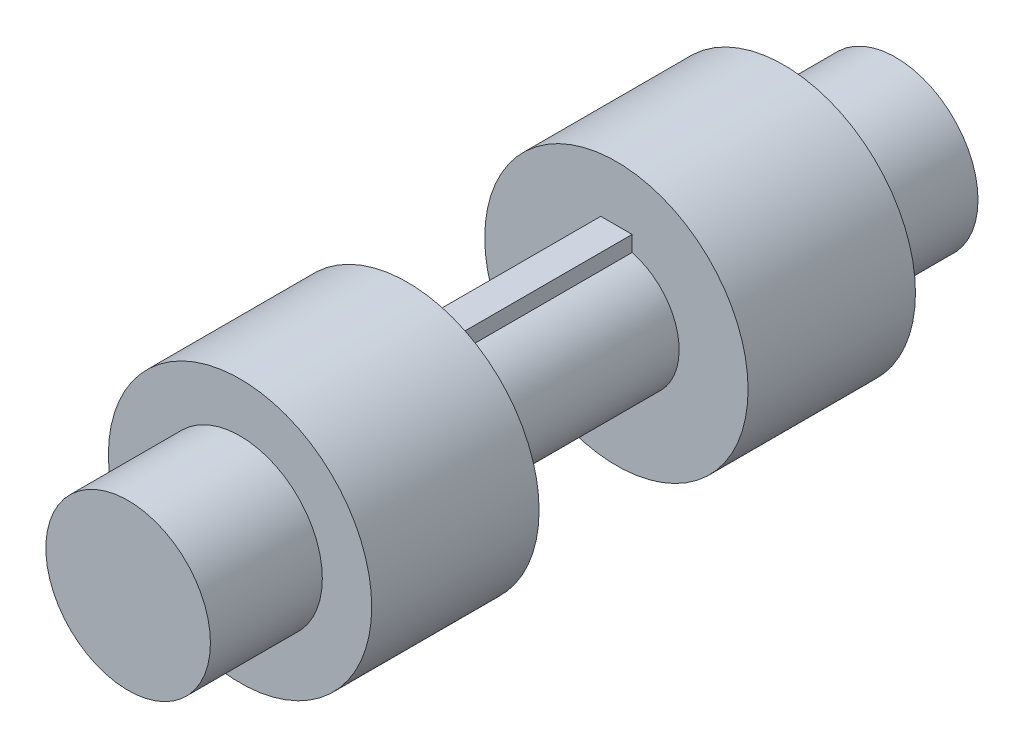
ISO-10303-21;
HEADER;
FILE_DESCRIPTION(('STEP AP214'),'2;1');
FILE_NAME('part.step','',(''),(''),'','','');
FILE_SCHEMA(('AUTOMOTIVE_DESIGN { 1 0 10303 214 1 1 1 1 }'));
ENDSEC;
DATA;
#1=APPLICATION_CONTEXT('core data for automotive mechanical design processes');
#2=APPLICATION_PROTOCOL_DEFINITION('international standard','automotive_design',2000,#1);
#3=PRODUCT_CONTEXT('',#1,'mechanical');
#4=PRODUCT('Part','Part','',(#3));
#5=PRODUCT_RELATED_PRODUCT_CATEGORY('part','',(#4));
#6=PRODUCT_DEFINITION_FORMATION('','',#4);
#7=PRODUCT_DEFINITION_CONTEXT('part definition',#1,'design');
#8=PRODUCT_DEFINITION('design','',#6,#7);
#9=PRODUCT_DEFINITION_SHAPE('','',#8);
#10=(LENGTH_UNIT() NAMED_UNIT(*) SI_UNIT(.MILLI.,.METRE.));
#11=(NAMED_UNIT(*) PLANE_ANGLE_UNIT() SI_UNIT($,.RADIAN.));
#12=(NAMED_UNIT(*) SI_UNIT($,.STERADIAN.) SOLID_ANGLE_UNIT());
#13=UNCERTAINTY_MEASURE_WITH_UNIT(LENGTH_MEASURE(1.E-05),#10,'distance_accuracy_value','');
#14=(GEOMETRIC_REPRESENTATION_CONTEXT(3) GLOBAL_UNCERTAINTY_ASSIGNED_CONTEXT((#13)) GLOBAL_UNIT_ASSIGNED_CONTEXT((#10,
#11,#12)) REPRESENTATION_CONTEXT('',''));
#15=CARTESIAN_POINT('',(0.,0.,0.));
#16=DIRECTION('',(0.,0.,1.));
#17=DIRECTION('',(1.,0.,0.));
#18=AXIS2_PLACEMENT_3D('',#15,#16,#17);
#19=CARTESIAN_POINT('',(0.,0.,-17.));
#20=DIRECTION('',(0.,0.,1.));
#21=DIRECTION('',(1.,0.,0.));
#22=AXIS2_PLACEMENT_3D('',#19,#20,#21);
#23=CYLINDRICAL_SURFACE('',#22,12.5);
#24=CARTESIAN_POINT('',(0.,0.,-17.));
#25=DIRECTION('',(0.,0.,1.));
#26=DIRECTION('',(1.,0.,0.));
#27=AXIS2_PLACEMENT_3D('',#24,#25,#26);
#28=CIRCLE('',#27,12.5);
#29=CARTESIAN_POINT('',(12.5,0.,-17.));
#30=VERTEX_POINT('',#29);
#31=EDGE_CURVE('E113',#30,#30,#28,.T.);
#32=ORIENTED_EDGE('',*,*,#31,.T.);
#33=EDGE_LOOP('',(#32));
#34=FACE_BOUND('',#33,.T.);
#35=CARTESIAN_POINT('',(0.,0.,0.));
#36=DIRECTION('',(0.,0.,1.));
#37=DIRECTION('',(1.,0.,0.));
#38=AXIS2_PLACEMENT_3D('',#35,#36,#37);
#39=CIRCLE('',#38,12.5);
#40=CARTESIAN_POINT('',(12.5,0.,0.));
#41=VERTEX_POINT('',#40);
#42=EDGE_CURVE('E36',#41,#41,#39,.T.);
#43=ORIENTED_EDGE('',*,*,#42,.F.);
#44=EDGE_LOOP('',(#43));
#45=FACE_BOUND('',#44,.T.);
#46=ADVANCED_FACE('F33',(#34,#45),#23,.T.);
#47=CARTESIAN_POINT('',(0.,0.,-17.));
#48=DIRECTION('',(0.,0.,1.));
#49=DIRECTION('',(1.,0.,0.));
#50=AXIS2_PLACEMENT_3D('',#47,#48,#49);
#51=PLANE('',#50);
#52=ORIENTED_EDGE('',*,*,#31,.F.);
#53=EDGE_LOOP('',(#52));
#54=FACE_BOUND('',#53,.T.);
#55=ADVANCED_FACE('F128',(#54),#51,.F.);
#56=CARTESIAN_POINT('',(0.,0.,25.425));
#57=DIRECTION('',(0.,0.,-1.));
#58=DIRECTION('',(-1.,0.,0.));
#59=AXIS2_PLACEMENT_3D('',#56,#57,#58);
#60=CYLINDRICAL_SURFACE('',#59,20.);
#61=CARTESIAN_POINT('',(0.,0.,25.425));
#62=DIRECTION('',(0.,0.,1.));
#63=DIRECTION('',(1.,0.,0.));
#64=AXIS2_PLACEMENT_3D('',#61,#62,#63);
#65=CIRCLE('',#64,20.);
#66=CARTESIAN_POINT('',(-20.,0.,25.425));
#67=VERTEX_POINT('',#66);
#68=EDGE_CURVE('E114',#67,#67,#65,.T.);
#69=CARTESIAN_POINT('',(0.,0.,0.));
#70=DIRECTION('',(0.,0.,1.));
#71=DIRECTION('',(1.,0.,0.));
#72=AXIS2_PLACEMENT_3D('',#69,#70,#71);
#73=CIRCLE('',#72,20.);
#74=CARTESIAN_POINT('',(-20.,0.,0.));
#75=VERTEX_POINT('',#74);
#76=EDGE_CURVE('E82',#75,#75,#73,.T.);
#77=CARTESIAN_POINT('',(-20.,0.,25.425));
#78=CARTESIAN_POINT('',(-20.,0.,25.16015625));
#79=CARTESIAN_POINT('',(-20.,0.,24.8953125));
#80=CARTESIAN_POINT('',(-20.,0.,24.365625));
#81=CARTESIAN_POINT('',(-20.,0.,24.10078125));
#82=CARTESIAN_POINT('',(-20.,0.,23.57109375));
#83=CARTESIAN_POINT('',(-20.,0.,23.30625));
#84=CARTESIAN_POINT('',(-20.,0.,22.7765625));
#85=CARTESIAN_POINT('',(-20.,0.,22.51171875));
#86=CARTESIAN_POINT('',(-20.,0.,21.98203125));
#87=CARTESIAN_POINT('',(-20.,0.,21.7171875));
#88=CARTESIAN_POINT('',(-20.,0.,21.1875));
#89=CARTESIAN_POINT('',(-20.,0.,20.92265625));
#90=CARTESIAN_POINT('',(-20.,0.,20.39296875));
#91=CARTESIAN_POINT('',(-20.,0.,20.128125));
#92=CARTESIAN_POINT('',(-20.,0.,19.5984375));
#93=CARTESIAN_POINT('',(-20.,0.,19.33359375));
#94=CARTESIAN_POINT('',(-20.,0.,18.80390625));
#95=CARTESIAN_POINT('',(-20.,0.,18.5390625));
#96=CARTESIAN_POINT('',(-20.,0.,18.009375));
#97=CARTESIAN_POINT('',(-20.,0.,17.74453125));
#98=CARTESIAN_POINT('',(-20.,0.,17.21484375));
#99=CARTESIAN_POINT('',(-20.,0.,16.95));
#100=CARTESIAN_POINT('',(-20.,0.,16.4203125));
#101=CARTESIAN_POINT('',(-20.,0.,16.15546875));
#102=CARTESIAN_POINT('',(-20.,0.,15.62578125));
#103=CARTESIAN_POINT('',(-20.,0.,15.3609375));
#104=CARTESIAN_POINT('',(-20.,0.,14.83125));
#105=CARTESIAN_POINT('',(-20.,0.,14.56640625));
#106=CARTESIAN_POINT('',(-20.,0.,14.03671875));
#107=CARTESIAN_POINT('',(-20.,0.,13.771875));
#108=CARTESIAN_POINT('',(-20.,0.,13.2421875));
#109=CARTESIAN_POINT('',(-20.,0.,12.97734375));
#110=CARTESIAN_POINT('',(-20.,0.,12.44765625));
#111=CARTESIAN_POINT('',(-20.,0.,12.1828125));
#112=CARTESIAN_POINT('',(-20.,0.,11.653125));
#113=CARTESIAN_POINT('',(-20.,0.,11.38828125));
#114=CARTESIAN_POINT('',(-20.,0.,10.85859375));
#115=CARTESIAN_POINT('',(-20.,0.,10.59375));
#116=CARTESIAN_POINT('',(-20.,0.,10.0640625));
#117=CARTESIAN_POINT('',(-20.,0.,9.79921875));
#118=CARTESIAN_POINT('',(-20.,0.,9.26953125));
#119=CARTESIAN_POINT('',(-20.,0.,9.0046875));
#120=CARTESIAN_POINT('',(-20.,0.,8.475));
#121=CARTESIAN_POINT('',(-20.,0.,8.21015625));
#122=CARTESIAN_POINT('',(-20.,0.,7.68046875));
#123=CARTESIAN_POINT('',(-20.,0.,7.415625));
#124=CARTESIAN_POINT('',(-20.,0.,6.8859375));
#125=CARTESIAN_POINT('',(-20.,0.,6.62109375));
#126=CARTESIAN_POINT('',(-20.,0.,6.09140625));
#127=CARTESIAN_POINT('',(-20.,0.,5.8265625));
#128=CARTESIAN_POINT('',(-20.,0.,5.296875));
#129=CARTESIAN_POINT('',(-20.,0.,5.03203125));
#130=CARTESIAN_POINT('',(-20.,0.,4.50234375));
#131=CARTESIAN_POINT('',(-20.,0.,4.2375));
#132=CARTESIAN_POINT('',(-20.,0.,3.7078125));
#133=CARTESIAN_POINT('',(-20.,0.,3.44296875));
#134=CARTESIAN_POINT('',(-20.,0.,2.91328125));
#135=CARTESIAN_POINT('',(-20.,0.,2.6484375));
#136=CARTESIAN_POINT('',(-20.,0.,2.11875));
#137=CARTESIAN_POINT('',(-20.,0.,1.85390625));
#138=CARTESIAN_POINT('',(-20.,0.,1.32421875));
#139=CARTESIAN_POINT('',(-20.,0.,1.059375));
#140=CARTESIAN_POINT('',(-20.,0.,0.529687500000001));
#141=CARTESIAN_POINT('',(-20.,0.,0.264843750000001));
#142=CARTESIAN_POINT('',(-20.,0.,0.));
#143=B_SPLINE_CURVE_WITH_KNOTS('',3,(#77,#78,#79,#80,#81,#82,#83,#84,#85,#86,#87,#88,#89,#90,
#91,#92,#93,#94,#95,#96,#97,#98,#99,#100,#101,#102,#103,#104,#105,#106,#107,#108,#109,#110,#111,
#112,#113,#114,#115,#116,#117,#118,#119,#120,#121,#122,#123,#124,#125,#126,#127,#128,#129,#130,
#131,#132,#133,#134,#135,#136,#137,#138,#139,#140,#141,#142),.UNSPECIFIED.,.F.,.F.,(4,2,2,2,2,2,
2,2,2,2,2,2,2,2,2,2,2,2,2,2,2,2,2,2,2,2,2,2,2,2,2,2,4),(0.,0.794531250000001,1.5890625,
2.38359375,3.178125,3.97265625,4.7671875,5.56171875,6.35625,7.15078125,7.9453125,8.73984375,
9.534375,10.32890625,11.1234375,11.91796875,12.7125,13.50703125,14.3015625,15.09609375,
15.890625,16.68515625,17.4796875,18.27421875,19.06875,19.86328125,20.6578125,21.45234375,
22.246875,23.04140625,23.8359375,24.63046875,25.425),.UNSPECIFIED.);
#144=EDGE_CURVE('BSEAM132',#67,#75,#143,.T.);
#145=ORIENTED_EDGE('',*,*,#68,.F.);
#146=ORIENTED_EDGE('',*,*,#76,.T.);
#147=ORIENTED_EDGE('',*,*,#144,.T.);
#148=ORIENTED_EDGE('',*,*,#144,.F.);
#149=EDGE_LOOP('',(#145,#147,#146,#148));
#150=FACE_BOUND('',#149,.T.);
#151=ADVANCED_FACE('F132',(#150),#60,.T.);
#152=CARTESIAN_POINT('',(0.,0.,25.425));
#153=DIRECTION('',(0.,0.,1.));
#154=DIRECTION('',(1.,0.,0.));
#155=AXIS2_PLACEMENT_3D('',#152,#153,#154);
#156=PLANE('',#155);
#157=DIRECTION('',(0.,1.,0.));
#158=VECTOR('',#157,1.);
#159=CARTESIAN_POINT('',(-2.38125,11.6037915931564,25.425));
#160=LINE('',#159,#158);
#161=CARTESIAN_POINT('',(-2.38125,9.22254159315641,25.425));
#162=VERTEX_POINT('',#161);
#163=CARTESIAN_POINT('',(-2.38125,11.6037915931564,25.425));
#164=VERTEX_POINT('',#163);
#165=EDGE_CURVE('E83',#162,#164,#160,.T.);
#166=ORIENTED_EDGE('',*,*,#165,.T.);
#167=DIRECTION('',(1.,0.,0.));
#168=VECTOR('',#167,1.);
#169=CARTESIAN_POINT('',(2.38125,11.6037915931564,25.425));
#170=LINE('',#169,#168);
#171=CARTESIAN_POINT('',(2.38125,11.6037915931564,25.425));
#172=VERTEX_POINT('',#171);
#173=EDGE_CURVE('E184',#164,#172,#170,.T.);
#174=ORIENTED_EDGE('',*,*,#173,.T.);
#175=DIRECTION('',(0.,-1.,0.));
#176=VECTOR('',#175,1.);
#177=CARTESIAN_POINT('',(2.38125,11.6037915931564,25.425));
#178=LINE('',#177,#176);
#179=CARTESIAN_POINT('',(2.38125,9.22254159315641,25.425));
#180=VERTEX_POINT('',#179);
#181=EDGE_CURVE('E49',#172,#180,#178,.T.);
#182=ORIENTED_EDGE('',*,*,#181,.T.);
#183=CARTESIAN_POINT('',(0.,0.,25.425));
#184=DIRECTION('',(0.,0.,1.));
#185=DIRECTION('',(1.,0.,0.));
#186=AXIS2_PLACEMENT_3D('',#183,#184,#185);
#187=CIRCLE('',#186,9.525);
#188=EDGE_CURVE('E42',#162,#180,#187,.T.);
#189=ORIENTED_EDGE('',*,*,#188,.F.);
#190=EDGE_LOOP('',(#166,#174,#182,#189));
#191=FACE_BOUND('',#190,.T.);
#192=ORIENTED_EDGE('',*,*,#68,.T.);
#193=EDGE_LOOP('',(#192));
#194=FACE_BOUND('',#193,.T.);
#195=ADVANCED_FACE('F137',(#191,#194),#156,.T.);
#196=CARTESIAN_POINT('',(0.,0.,0.));
#197=DIRECTION('',(0.,0.,1.));
#198=DIRECTION('',(1.,0.,0.));
#199=AXIS2_PLACEMENT_3D('',#196,#197,#198);
#200=PLANE('',#199);
#201=ORIENTED_EDGE('',*,*,#42,.T.);
#202=EDGE_LOOP('',(#201));
#203=FACE_BOUND('',#202,.T.);
#204=ORIENTED_EDGE('',*,*,#76,.F.);
#205=EDGE_LOOP('',(#204));
#206=FACE_BOUND('',#205,.T.);
#207=ADVANCED_FACE('F124',(#203,#206),#200,.F.);
#208=CARTESIAN_POINT('',(0.,0.,57.175));
#209=DIRECTION('',(0.,0.,-1.));
#210=DIRECTION('',(-1.,0.,0.));
#211=AXIS2_PLACEMENT_3D('',#208,#209,#210);
#212=CYLINDRICAL_SURFACE('',#211,9.525);
#213=CARTESIAN_POINT('',(0.,0.,57.175));
#214=DIRECTION('',(0.,0.,1.));
#215=DIRECTION('',(1.,0.,0.));
#216=AXIS2_PLACEMENT_3D('',#213,#214,#215);
#217=CIRCLE('',#216,9.525);
#218=CARTESIAN_POINT('',(-2.38125,9.22254159315641,57.175));
#219=VERTEX_POINT('',#218);
#220=CARTESIAN_POINT('',(2.38125,9.22254159315641,57.175));
#221=VERTEX_POINT('',#220);
#222=EDGE_CURVE('E72',#219,#221,#217,.T.);
#223=ORIENTED_EDGE('',*,*,#222,.F.);
#224=DIRECTION('',(0.,0.,1.));
#225=VECTOR('',#224,1.);
#226=CARTESIAN_POINT('',(-2.38125,9.22254159315641,20.1003631285786));
#227=LINE('',#226,#225);
#228=EDGE_CURVE('E76',#162,#219,#227,.T.);
#229=ORIENTED_EDGE('',*,*,#228,.F.);
#230=ORIENTED_EDGE('',*,*,#188,.T.);
#231=DIRECTION('',(0.,0.,1.));
#232=VECTOR('',#231,1.);
#233=CARTESIAN_POINT('',(2.38125,9.22254159315641,20.1003631285786));
#234=LINE('',#233,#232);
#235=EDGE_CURVE('E78',#180,#221,#234,.T.);
#236=ORIENTED_EDGE('',*,*,#235,.T.);
#237=EDGE_LOOP('',(#223,#229,#230,#236));
#238=FACE_BOUND('',#237,.T.);
#239=ADVANCED_FACE('F74',(#238),#212,.T.);
#240=CARTESIAN_POINT('',(-2.38125,11.6037915931564,20.1003631285786));
#241=DIRECTION('',(-1.,0.,0.));
#242=DIRECTION('',(0.,-1.,0.));
#243=AXIS2_PLACEMENT_3D('',#240,#241,#242);
#244=PLANE('',#243);
#245=ORIENTED_EDGE('',*,*,#165,.F.);
#246=ORIENTED_EDGE('',*,*,#228,.T.);
#247=DIRECTION('',(0.,-1.,0.));
#248=VECTOR('',#247,1.);
#249=CARTESIAN_POINT('',(-2.38125,11.6037915931564,57.175));
#250=LINE('',#249,#248);
#251=CARTESIAN_POINT('',(-2.38125,11.6037915931564,57.175));
#252=VERTEX_POINT('',#251);
#253=EDGE_CURVE('E89',#252,#219,#250,.T.);
#254=ORIENTED_EDGE('',*,*,#253,.F.);
#255=DIRECTION('',(0.,0.,1.));
#256=VECTOR('',#255,1.);
#257=CARTESIAN_POINT('',(-2.38125,11.6037915931564,20.1003631285786));
#258=LINE('',#257,#256);
#259=EDGE_CURVE('E107',#164,#252,#258,.T.);
#260=ORIENTED_EDGE('',*,*,#259,.F.);
#261=EDGE_LOOP('',(#245,#246,#254,#260));
#262=FACE_BOUND('',#261,.T.);
#263=ADVANCED_FACE('F87',(#262),#244,.T.);
#264=CARTESIAN_POINT('',(2.38125,11.6037915931564,20.1003631285786));
#265=DIRECTION('',(0.,1.,0.));
#266=DIRECTION('',(0.,0.,1.));
#267=AXIS2_PLACEMENT_3D('',#264,#265,#266);
#268=PLANE('',#267);
#269=ORIENTED_EDGE('',*,*,#173,.F.);
#270=ORIENTED_EDGE('',*,*,#259,.T.);
#271=DIRECTION('',(-1.,0.,0.));
#272=VECTOR('',#271,1.);
#273=CARTESIAN_POINT('',(2.38125,11.6037915931564,57.175));
#274=LINE('',#273,#272);
#275=CARTESIAN_POINT('',(2.38125,11.6037915931564,57.175));
#276=VERTEX_POINT('',#275);
#277=EDGE_CURVE('E92',#276,#252,#274,.T.);
#278=ORIENTED_EDGE('',*,*,#277,.F.);
#279=DIRECTION('',(0.,0.,1.));
#280=VECTOR('',#279,1.);
#281=CARTESIAN_POINT('',(2.38125,11.6037915931564,20.1003631285786));
#282=LINE('',#281,#280);
#283=EDGE_CURVE('E109',#172,#276,#282,.T.);
#284=ORIENTED_EDGE('',*,*,#283,.F.);
#285=EDGE_LOOP('',(#269,#270,#278,#284));
#286=FACE_BOUND('',#285,.T.);
#287=ADVANCED_FACE('F150',(#286),#268,.T.);
#288=CARTESIAN_POINT('',(2.38125,11.6037915931564,20.1003631285786));
#289=DIRECTION('',(1.,0.,0.));
#290=DIRECTION('',(0.,0.,-1.));
#291=AXIS2_PLACEMENT_3D('',#288,#289,#290);
#292=PLANE('',#291);
#293=ORIENTED_EDGE('',*,*,#181,.F.);
#294=ORIENTED_EDGE('',*,*,#283,.T.);
#295=DIRECTION('',(0.,1.,0.));
#296=VECTOR('',#295,1.);
#297=CARTESIAN_POINT('',(2.38125,11.6037915931564,57.175));
#298=LINE('',#297,#296);
#299=EDGE_CURVE('E96',#221,#276,#298,.T.);
#300=ORIENTED_EDGE('',*,*,#299,.F.);
#301=ORIENTED_EDGE('',*,*,#235,.F.);
#302=EDGE_LOOP('',(#293,#294,#300,#301));
#303=FACE_BOUND('',#302,.T.);
#304=ADVANCED_FACE('F151',(#303),#292,.T.);
#305=CARTESIAN_POINT('',(0.,0.,57.175));
#306=DIRECTION('',(0.,0.,1.));
#307=DIRECTION('',(1.,0.,0.));
#308=AXIS2_PLACEMENT_3D('',#305,#306,#307);
#309=PLANE('',#308);
#310=CARTESIAN_POINT('',(0.,0.,57.175));
#311=DIRECTION('',(0.,0.,1.));
#312=DIRECTION('',(1.,0.,0.));
#313=AXIS2_PLACEMENT_3D('',#310,#311,#312);
#314=CIRCLE('',#313,20.);
#315=CARTESIAN_POINT('',(-20.,0.,57.175));
#316=VERTEX_POINT('',#315);
#317=EDGE_CURVE('E101',#316,#316,#314,.T.);
#318=ORIENTED_EDGE('',*,*,#317,.F.);
#319=EDGE_LOOP('',(#318));
#320=FACE_BOUND('',#319,.T.);
#321=ORIENTED_EDGE('',*,*,#253,.T.);
#322=ORIENTED_EDGE('',*,*,#222,.T.);
#323=ORIENTED_EDGE('',*,*,#299,.T.);
#324=ORIENTED_EDGE('',*,*,#277,.T.);
#325=EDGE_LOOP('',(#321,#322,#323,#324));
#326=FACE_BOUND('',#325,.T.);
#327=ADVANCED_FACE('F94',(#320,#326),#309,.F.);
#328=CARTESIAN_POINT('',(0.,0.,82.6));
#329=DIRECTION('',(0.,0.,-1.));
#330=DIRECTION('',(-1.,0.,0.));
#331=AXIS2_PLACEMENT_3D('',#328,#329,#330);
#332=CYLINDRICAL_SURFACE('',#331,20.);
#333=CARTESIAN_POINT('',(0.,0.,82.6));
#334=DIRECTION('',(0.,0.,1.));
#335=DIRECTION('',(1.,0.,0.));
#336=AXIS2_PLACEMENT_3D('',#333,#334,#335);
#337=CIRCLE('',#336,20.);
#338=CARTESIAN_POINT('',(-20.,0.,82.6));
#339=VERTEX_POINT('',#338);
#340=EDGE_CURVE('E97',#339,#339,#337,.T.);
#341=CARTESIAN_POINT('',(-20.,0.,82.6));
#342=CARTESIAN_POINT('',(-20.,0.,82.33515625));
#343=CARTESIAN_POINT('',(-20.,0.,82.0703125));
#344=CARTESIAN_POINT('',(-20.,0.,81.540625));
#345=CARTESIAN_POINT('',(-20.,0.,81.27578125));
#346=CARTESIAN_POINT('',(-20.,0.,80.74609375));
#347=CARTESIAN_POINT('',(-20.,0.,80.48125));
#348=CARTESIAN_POINT('',(-20.,0.,79.9515625));
#349=CARTESIAN_POINT('',(-20.,0.,79.68671875));
#350=CARTESIAN_POINT('',(-20.,0.,79.15703125));
#351=CARTESIAN_POINT('',(-20.,0.,78.8921875));
#352=CARTESIAN_POINT('',(-20.,0.,78.3625));
#353=CARTESIAN_POINT('',(-20.,0.,78.09765625));
#354=CARTESIAN_POINT('',(-20.,0.,77.56796875));
#355=CARTESIAN_POINT('',(-20.,0.,77.303125));
#356=CARTESIAN_POINT('',(-20.,0.,76.7734375));
#357=CARTESIAN_POINT('',(-20.,0.,76.50859375));
#358=CARTESIAN_POINT('',(-20.,0.,75.97890625));
#359=CARTESIAN_POINT('',(-20.,0.,75.7140625));
#360=CARTESIAN_POINT('',(-20.,0.,75.184375));
#361=CARTESIAN_POINT('',(-20.,0.,74.91953125));
#362=CARTESIAN_POINT('',(-20.,0.,74.38984375));
#363=CARTESIAN_POINT('',(-20.,0.,74.125));
#364=CARTESIAN_POINT('',(-20.,0.,73.5953125));
#365=CARTESIAN_POINT('',(-20.,0.,73.33046875));
#366=CARTESIAN_POINT('',(-20.,0.,72.80078125));
#367=CARTESIAN_POINT('',(-20.,0.,72.5359375));
#368=CARTESIAN_POINT('',(-20.,0.,72.00625));
#369=CARTESIAN_POINT('',(-20.,0.,71.74140625));
#370=CARTESIAN_POINT('',(-20.,0.,71.21171875));
#371=CARTESIAN_POINT('',(-20.,0.,70.946875));
#372=CARTESIAN_POINT('',(-20.,0.,70.4171875));
#373=CARTESIAN_POINT('',(-20.,0.,70.15234375));
#374=CARTESIAN_POINT('',(-20.,0.,69.62265625));
#375=CARTESIAN_POINT('',(-20.,0.,69.3578125));
#376=CARTESIAN_POINT('',(-20.,0.,68.828125));
#377=CARTESIAN_POINT('',(-20.,0.,68.56328125));
#378=CARTESIAN_POINT('',(-20.,0.,68.03359375));
#379=CARTESIAN_POINT('',(-20.,0.,67.76875));
#380=CARTESIAN_POINT('',(-20.,0.,67.2390625));
#381=CARTESIAN_POINT('',(-20.,0.,66.97421875));
#382=CARTESIAN_POINT('',(-20.,0.,66.44453125));
#383=CARTESIAN_POINT('',(-20.,0.,66.1796875));
#384=CARTESIAN_POINT('',(-20.,0.,65.65));
#385=CARTESIAN_POINT('',(-20.,0.,65.38515625));
#386=CARTESIAN_POINT('',(-20.,0.,64.85546875));
#387=CARTESIAN_POINT('',(-20.,0.,64.590625));
#388=CARTESIAN_POINT('',(-20.,0.,64.0609375));
#389=CARTESIAN_POINT('',(-20.,0.,63.79609375));
#390=CARTESIAN_POINT('',(-20.,0.,63.26640625));
#391=CARTESIAN_POINT('',(-20.,0.,63.0015625));
#392=CARTESIAN_POINT('',(-20.,0.,62.471875));
#393=CARTESIAN_POINT('',(-20.,0.,62.20703125));
#394=CARTESIAN_POINT('',(-20.,0.,61.67734375));
#395=CARTESIAN_POINT('',(-20.,0.,61.4125));
#396=CARTESIAN_POINT('',(-20.,0.,60.8828125));
#397=CARTESIAN_POINT('',(-20.,0.,60.61796875));
#398=CARTESIAN_POINT('',(-20.,0.,60.08828125));
#399=CARTESIAN_POINT('',(-20.,0.,59.8234375));
#400=CARTESIAN_POINT('',(-20.,0.,59.29375));
#401=CARTESIAN_POINT('',(-20.,0.,59.02890625));
#402=CARTESIAN_POINT('',(-20.,0.,58.49921875));
#403=CARTESIAN_POINT('',(-20.,0.,58.234375));
#404=CARTESIAN_POINT('',(-20.,0.,57.7046875));
#405=CARTESIAN_POINT('',(-20.,0.,57.43984375));
#406=CARTESIAN_POINT('',(-20.,0.,57.175));
#407=B_SPLINE_CURVE_WITH_KNOTS('',3,(#341,#342,#343,#344,#345,#346,#347,#348,#349,#350,#351,
#352,#353,#354,#355,#356,#357,#358,#359,#360,#361,#362,#363,#364,#365,#366,#367,#368,#369,#370,
#371,#372,#373,#374,#375,#376,#377,#378,#379,#380,#381,#382,#383,#384,#385,#386,#387,#388,#389,
#390,#391,#392,#393,#394,#395,#396,#397,#398,#399,#400,#401,#402,#403,#404,#405,#406),
.UNSPECIFIED.,.F.,.F.,(4,2,2,2,2,2,2,2,2,2,2,2,2,2,2,2,2,2,2,2,2,2,2,2,2,2,2,2,2,2,2,2,4),(0.,
0.794531250000008,1.5890625,2.38359375000001,3.178125,3.97265625000001,4.76718750000001,
5.56171875,6.35625000000001,7.15078125,7.94531250000001,8.73984375,9.53437500000001,10.32890625,
11.1234375,11.91796875,12.7125,13.50703125,14.3015625,15.09609375,15.890625,16.68515625,
17.4796875,18.27421875,19.06875,19.86328125,20.6578125,21.45234375,22.246875,23.04140625,
23.8359375,24.63046875,25.425),.UNSPECIFIED.);
#408=EDGE_CURVE('BSEAM157',#339,#316,#407,.T.);
#409=ORIENTED_EDGE('',*,*,#340,.F.);
#410=ORIENTED_EDGE('',*,*,#317,.T.);
#411=ORIENTED_EDGE('',*,*,#408,.T.);
#412=ORIENTED_EDGE('',*,*,#408,.F.);
#413=EDGE_LOOP('',(#409,#411,#410,#412));
#414=FACE_BOUND('',#413,.T.);
#415=ADVANCED_FACE('F157',(#414),#332,.T.);
#416=CARTESIAN_POINT('',(0.,0.,82.6));
#417=DIRECTION('',(0.,0.,1.));
#418=DIRECTION('',(1.,0.,0.));
#419=AXIS2_PLACEMENT_3D('',#416,#417,#418);
#420=PLANE('',#419);
#421=CARTESIAN_POINT('',(0.,0.,82.6));
#422=DIRECTION('',(0.,0.,1.));
#423=DIRECTION('',(1.,0.,0.));
#424=AXIS2_PLACEMENT_3D('',#421,#422,#423);
#425=CIRCLE('',#424,12.5);
#426=CARTESIAN_POINT('',(12.5,0.,82.6));
#427=VERTEX_POINT('',#426);
#428=EDGE_CURVE('E11',#427,#427,#425,.T.);
#429=ORIENTED_EDGE('',*,*,#428,.F.);
#430=EDGE_LOOP('',(#429));
#431=FACE_BOUND('',#430,.T.);
#432=ORIENTED_EDGE('',*,*,#340,.T.);
#433=EDGE_LOOP('',(#432));
#434=FACE_BOUND('',#433,.T.);
#435=ADVANCED_FACE('F160',(#431,#434),#420,.T.);
#436=CARTESIAN_POINT('',(0.,0.,99.6));
#437=DIRECTION('',(0.,0.,-1.));
#438=DIRECTION('',(-1.,0.,0.));
#439=AXIS2_PLACEMENT_3D('',#436,#437,#438);
#440=CYLINDRICAL_SURFACE('',#439,12.5);
#441=CARTESIAN_POINT('',(0.,0.,99.6));
#442=DIRECTION('',(0.,0.,1.));
#443=DIRECTION('',(1.,0.,0.));
#444=AXIS2_PLACEMENT_3D('',#441,#442,#443);
#445=CIRCLE('',#444,12.5);
#446=CARTESIAN_POINT('',(12.5,0.,99.6));
#447=VERTEX_POINT('',#446);
#448=EDGE_CURVE('E179',#447,#447,#445,.T.);
#449=ORIENTED_EDGE('',*,*,#448,.F.);
#450=EDGE_LOOP('',(#449));
#451=FACE_BOUND('',#450,.T.);
#452=ORIENTED_EDGE('',*,*,#428,.T.);
#453=EDGE_LOOP('',(#452));
#454=FACE_BOUND('',#453,.T.);
#455=ADVANCED_FACE('F167',(#451,#454),#440,.T.);
#456=CARTESIAN_POINT('',(0.,0.,99.6));
#457=DIRECTION('',(0.,0.,1.));
#458=DIRECTION('',(1.,0.,0.));
#459=AXIS2_PLACEMENT_3D('',#456,#457,#458);
#460=PLANE('',#459);
#461=ORIENTED_EDGE('',*,*,#448,.T.);
#462=EDGE_LOOP('',(#461));
#463=FACE_BOUND('',#462,.T.);
#464=ADVANCED_FACE('F171',(#463),#460,.T.);
#465=CLOSED_SHELL('',(#46,#55,#151,#195,#207,#239,#263,#287,#304,#327,#415,#435,#455,#464));
#466=MANIFOLD_SOLID_BREP('B2',#465);
#467=ADVANCED_BREP_SHAPE_REPRESENTATION('',(#18,#466),#14);
#468=SHAPE_DEFINITION_REPRESENTATION(#9,#467);
ENDSEC;
END-ISO-10303-21;
